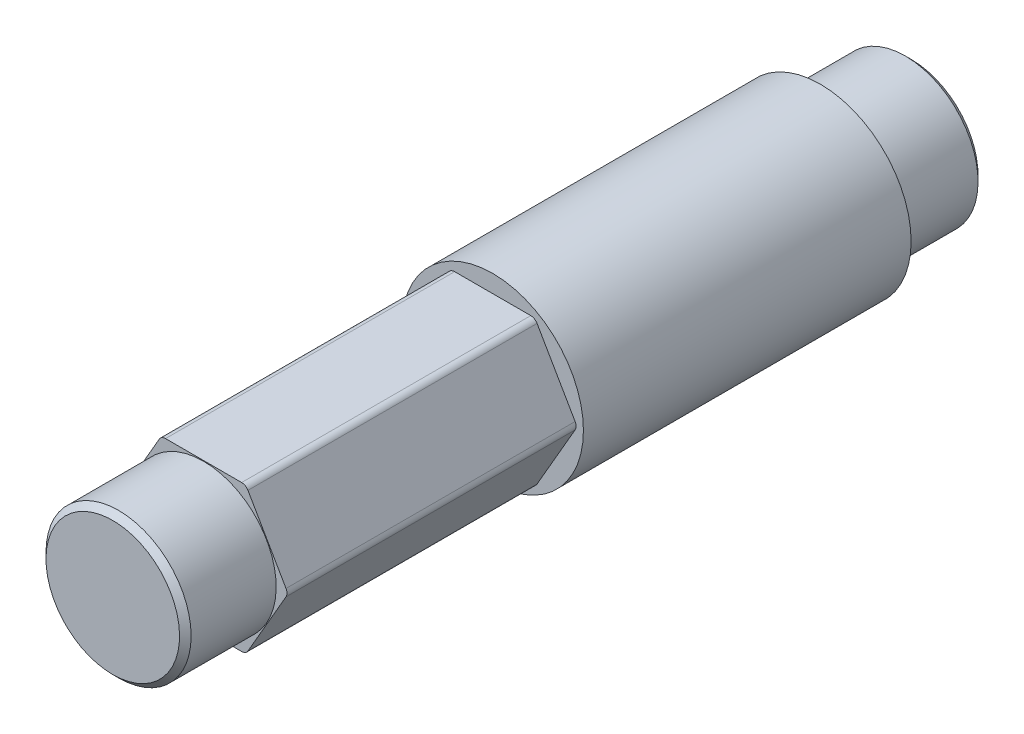
ISO-10303-21;
HEADER;
FILE_DESCRIPTION(('STEP AP214'),'2;1');
FILE_NAME('part.step','',(''),(''),'','','');
FILE_SCHEMA(('AUTOMOTIVE_DESIGN { 1 0 10303 214 1 1 1 1 }'));
ENDSEC;
DATA;
#1=APPLICATION_CONTEXT('core data for automotive mechanical design processes');
#2=APPLICATION_PROTOCOL_DEFINITION('international standard','automotive_design',2000,#1);
#3=PRODUCT_CONTEXT('',#1,'mechanical');
#4=PRODUCT('Part','Part','',(#3));
#5=PRODUCT_RELATED_PRODUCT_CATEGORY('part','',(#4));
#6=PRODUCT_DEFINITION_FORMATION('','',#4);
#7=PRODUCT_DEFINITION_CONTEXT('part definition',#1,'design');
#8=PRODUCT_DEFINITION('design','',#6,#7);
#9=PRODUCT_DEFINITION_SHAPE('','',#8);
#10=(LENGTH_UNIT() NAMED_UNIT(*) SI_UNIT(.MILLI.,.METRE.));
#11=(NAMED_UNIT(*) PLANE_ANGLE_UNIT() SI_UNIT($,.RADIAN.));
#12=(NAMED_UNIT(*) SI_UNIT($,.STERADIAN.) SOLID_ANGLE_UNIT());
#13=UNCERTAINTY_MEASURE_WITH_UNIT(LENGTH_MEASURE(1.E-05),#10,'distance_accuracy_value','');
#14=(GEOMETRIC_REPRESENTATION_CONTEXT(3) GLOBAL_UNCERTAINTY_ASSIGNED_CONTEXT((#13)) GLOBAL_UNIT_ASSIGNED_CONTEXT((#10,
#11,#12)) REPRESENTATION_CONTEXT('',''));
#15=CARTESIAN_POINT('',(0.,0.,0.));
#16=DIRECTION('',(0.,0.,1.));
#17=DIRECTION('',(1.,0.,0.));
#18=AXIS2_PLACEMENT_3D('',#15,#16,#17);
#19=CARTESIAN_POINT('',(0.,7.62,-33.2486));
#20=DIRECTION('',(0.,0.,1.));
#21=DIRECTION('',(0.,-1.,0.));
#22=AXIS2_PLACEMENT_3D('',#19,#20,#21);
#23=PLANE('',#22);
#24=CARTESIAN_POINT('',(0.,0.,-33.2486));
#25=DIRECTION('',(0.,0.,-1.));
#26=DIRECTION('',(0.,1.,0.));
#27=AXIS2_PLACEMENT_3D('',#24,#25,#26);
#28=CIRCLE('',#27,7.9375);
#29=CARTESIAN_POINT('',(0.,7.9375,-33.2486));
#30=VERTEX_POINT('',#29);
#31=EDGE_CURVE('E225',#30,#30,#28,.T.);
#32=ORIENTED_EDGE('',*,*,#31,.F.);
#33=EDGE_LOOP('',(#32));
#34=FACE_BOUND('',#33,.T.);
#35=DIRECTION('',(0.5,0.866025403784439,0.));
#36=VECTOR('',#35,1.);
#37=CARTESIAN_POINT('',(-3.6969700727127,6.40334,-33.2486));
#38=LINE('',#37,#36);
#39=CARTESIAN_POINT('',(-7.21063143495769,0.317499999999992,-33.2486));
#40=VERTEX_POINT('',#39);
#41=CARTESIAN_POINT('',(-3.88027878318041,6.08584,-33.2486));
#42=VERTEX_POINT('',#41);
#43=EDGE_CURVE('E196',#40,#42,#38,.T.);
#44=ORIENTED_EDGE('',*,*,#43,.T.);
#45=CARTESIAN_POINT('',(-3.33035265177729,5.76834,-33.2486));
#46=DIRECTION('',(0.,0.,1.));
#47=DIRECTION('',(0.,-1.,0.));
#48=AXIS2_PLACEMENT_3D('',#45,#46,#47);
#49=CIRCLE('',#48,0.635);
#50=CARTESIAN_POINT('',(-3.33035265177729,6.40334,-33.2486));
#51=VERTEX_POINT('',#50);
#52=EDGE_CURVE('E43',#42,#51,#49,.F.);
#53=ORIENTED_EDGE('',*,*,#52,.T.);
#54=DIRECTION('',(1.,0.,0.));
#55=VECTOR('',#54,1.);
#56=CARTESIAN_POINT('',(3.6969700727127,6.40334,-33.2486));
#57=LINE('',#56,#55);
#58=CARTESIAN_POINT('',(3.33035265177728,6.40334,-33.2486));
#59=VERTEX_POINT('',#58);
#60=EDGE_CURVE('E194',#51,#59,#57,.T.);
#61=ORIENTED_EDGE('',*,*,#60,.T.);
#62=CARTESIAN_POINT('',(3.33035265177728,5.76834,-33.2486));
#63=DIRECTION('',(0.,0.,1.));
#64=DIRECTION('',(0.,-1.,0.));
#65=AXIS2_PLACEMENT_3D('',#62,#63,#64);
#66=CIRCLE('',#65,0.635);
#67=CARTESIAN_POINT('',(3.8802787831804,6.08584,-33.2486));
#68=VERTEX_POINT('',#67);
#69=EDGE_CURVE('E190',#59,#68,#66,.F.);
#70=ORIENTED_EDGE('',*,*,#69,.T.);
#71=DIRECTION('',(0.5,-0.866025403784438,0.));
#72=VECTOR('',#71,1.);
#73=CARTESIAN_POINT('',(7.3939401454254,0.,-33.2486));
#74=LINE('',#73,#72);
#75=CARTESIAN_POINT('',(7.21063143495769,0.317500000000003,-33.2486));
#76=VERTEX_POINT('',#75);
#77=EDGE_CURVE('E204',#68,#76,#74,.T.);
#78=ORIENTED_EDGE('',*,*,#77,.T.);
#79=CARTESIAN_POINT('',(6.66070530355457,0.,-33.2486));
#80=DIRECTION('',(0.,0.,1.));
#81=DIRECTION('',(0.,-1.,0.));
#82=AXIS2_PLACEMENT_3D('',#79,#80,#81);
#83=CIRCLE('',#82,0.635);
#84=CARTESIAN_POINT('',(7.21063143495769,-0.317499999999996,-33.2486));
#85=VERTEX_POINT('',#84);
#86=EDGE_CURVE('E188',#76,#85,#83,.F.);
#87=ORIENTED_EDGE('',*,*,#86,.T.);
#88=DIRECTION('',(-0.5,-0.866025403784439,0.));
#89=VECTOR('',#88,1.);
#90=CARTESIAN_POINT('',(3.6969700727127,-6.40334,-33.2486));
#91=LINE('',#90,#89);
#92=CARTESIAN_POINT('',(3.8802787831804,-6.08584,-33.2486));
#93=VERTEX_POINT('',#92);
#94=EDGE_CURVE('E425',#85,#93,#91,.T.);
#95=ORIENTED_EDGE('',*,*,#94,.T.);
#96=CARTESIAN_POINT('',(3.33035265177729,-5.76834,-33.2486));
#97=DIRECTION('',(0.,0.,1.));
#98=DIRECTION('',(0.,-1.,0.));
#99=AXIS2_PLACEMENT_3D('',#96,#97,#98);
#100=CIRCLE('',#99,0.635);
#101=CARTESIAN_POINT('',(3.33035265177729,-6.40334,-33.2486));
#102=VERTEX_POINT('',#101);
#103=EDGE_CURVE('E186',#93,#102,#100,.F.);
#104=ORIENTED_EDGE('',*,*,#103,.T.);
#105=DIRECTION('',(-1.,0.,0.));
#106=VECTOR('',#105,1.);
#107=CARTESIAN_POINT('',(-3.69697007271269,-6.40334,-33.2486));
#108=LINE('',#107,#106);
#109=CARTESIAN_POINT('',(-3.33035265177728,-6.40334,-33.2486));
#110=VERTEX_POINT('',#109);
#111=EDGE_CURVE('E428',#102,#110,#108,.T.);
#112=ORIENTED_EDGE('',*,*,#111,.T.);
#113=CARTESIAN_POINT('',(-3.33035265177728,-5.76834,-33.2486));
#114=DIRECTION('',(0.,0.,1.));
#115=DIRECTION('',(0.,-1.,0.));
#116=AXIS2_PLACEMENT_3D('',#113,#114,#115);
#117=CIRCLE('',#116,0.635);
#118=CARTESIAN_POINT('',(-3.8802787831804,-6.08584,-33.2486));
#119=VERTEX_POINT('',#118);
#120=EDGE_CURVE('E184',#110,#119,#117,.F.);
#121=ORIENTED_EDGE('',*,*,#120,.T.);
#122=DIRECTION('',(-0.5,0.866025403784438,0.));
#123=VECTOR('',#122,1.);
#124=CARTESIAN_POINT('',(-7.39394014542539,0.,-33.2486));
#125=LINE('',#124,#123);
#126=CARTESIAN_POINT('',(-7.21063143495769,-0.317500000000004,-33.2486));
#127=VERTEX_POINT('',#126);
#128=EDGE_CURVE('E442',#119,#127,#125,.T.);
#129=ORIENTED_EDGE('',*,*,#128,.T.);
#130=CARTESIAN_POINT('',(-6.66070530355457,0.,-33.2486));
#131=DIRECTION('',(0.,0.,1.));
#132=DIRECTION('',(0.,-1.,0.));
#133=AXIS2_PLACEMENT_3D('',#130,#131,#132);
#134=CIRCLE('',#133,0.635);
#135=EDGE_CURVE('E12',#127,#40,#134,.F.);
#136=ORIENTED_EDGE('',*,*,#135,.T.);
#137=EDGE_LOOP('',(#44,#53,#61,#70,#78,#87,#95,#104,#112,#121,#129,#136));
#138=FACE_BOUND('',#137,.T.);
#139=ADVANCED_FACE('F35',(#34,#138),#23,.T.);
#140=CARTESIAN_POINT('',(0.,0.,0.));
#141=DIRECTION('',(0.,0.,-1.));
#142=DIRECTION('',(0.,1.,0.));
#143=AXIS2_PLACEMENT_3D('',#140,#141,#142);
#144=CYLINDRICAL_SURFACE('',#143,7.9375);
#145=ORIENTED_EDGE('',*,*,#31,.T.);
#146=EDGE_LOOP('',(#145));
#147=FACE_BOUND('',#146,.T.);
#148=CARTESIAN_POINT('',(0.,0.,-61.9252));
#149=DIRECTION('',(0.,0.,-1.));
#150=DIRECTION('',(0.,1.,0.));
#151=AXIS2_PLACEMENT_3D('',#148,#149,#150);
#152=CIRCLE('',#151,7.9375);
#153=CARTESIAN_POINT('',(0.,7.9375,-61.9252));
#154=VERTEX_POINT('',#153);
#155=EDGE_CURVE('E222',#154,#154,#152,.T.);
#156=ORIENTED_EDGE('',*,*,#155,.F.);
#157=EDGE_LOOP('',(#156));
#158=FACE_BOUND('',#157,.T.);
#159=ADVANCED_FACE('F258',(#147,#158),#144,.T.);
#160=CARTESIAN_POINT('',(0.,7.9375,-61.9252));
#161=DIRECTION('',(0.,0.,-1.));
#162=DIRECTION('',(0.,1.,0.));
#163=AXIS2_PLACEMENT_3D('',#160,#161,#162);
#164=PLANE('',#163);
#165=ORIENTED_EDGE('',*,*,#155,.T.);
#166=EDGE_LOOP('',(#165));
#167=FACE_BOUND('',#166,.T.);
#168=CARTESIAN_POINT('',(0.,0.,-61.9252));
#169=DIRECTION('',(0.,0.,-1.));
#170=DIRECTION('',(0.,1.,0.));
#171=AXIS2_PLACEMENT_3D('',#168,#169,#170);
#172=CIRCLE('',#171,6.34999999999999);
#173=CARTESIAN_POINT('',(0.,6.35,-61.9252));
#174=VERTEX_POINT('',#173);
#175=EDGE_CURVE('E219',#174,#174,#172,.T.);
#176=ORIENTED_EDGE('',*,*,#175,.F.);
#177=EDGE_LOOP('',(#176));
#178=FACE_BOUND('',#177,.T.);
#179=ADVANCED_FACE('F264',(#167,#178),#164,.T.);
#180=CARTESIAN_POINT('',(0.,0.,0.));
#181=DIRECTION('',(0.,0.,-1.));
#182=DIRECTION('',(0.,1.,0.));
#183=AXIS2_PLACEMENT_3D('',#180,#181,#182);
#184=CYLINDRICAL_SURFACE('',#183,6.34999999999999);
#185=CARTESIAN_POINT('',(0.,0.,-69.3674));
#186=DIRECTION('',(0.,0.,-1.));
#187=DIRECTION('',(0.,1.,0.));
#188=AXIS2_PLACEMENT_3D('',#185,#186,#187);
#189=CIRCLE('',#188,6.34999999999999);
#190=CARTESIAN_POINT('',(0.,6.35,-69.3674));
#191=VERTEX_POINT('',#190);
#192=EDGE_CURVE('E144',#191,#191,#189,.F.);
#193=ORIENTED_EDGE('',*,*,#192,.T.);
#194=EDGE_LOOP('',(#193));
#195=FACE_BOUND('',#194,.T.);
#196=ORIENTED_EDGE('',*,*,#175,.T.);
#197=EDGE_LOOP('',(#196));
#198=FACE_BOUND('',#197,.T.);
#199=ADVANCED_FACE('F304',(#195,#198),#184,.T.);
#200=CARTESIAN_POINT('',(0.,6.35,-69.8754));
#201=DIRECTION('',(0.,0.,-1.));
#202=DIRECTION('',(0.,1.,0.));
#203=AXIS2_PLACEMENT_3D('',#200,#201,#202);
#204=PLANE('',#203);
#205=CARTESIAN_POINT('',(0.,0.,-69.8754));
#206=DIRECTION('',(0.,0.,-1.));
#207=DIRECTION('',(0.,1.,0.));
#208=AXIS2_PLACEMENT_3D('',#205,#206,#207);
#209=CIRCLE('',#208,5.842);
#210=CARTESIAN_POINT('',(0.,5.84200000000001,-69.8754));
#211=VERTEX_POINT('',#210);
#212=EDGE_CURVE('E148',#211,#211,#209,.T.);
#213=ORIENTED_EDGE('',*,*,#212,.T.);
#214=EDGE_LOOP('',(#213));
#215=FACE_BOUND('',#214,.T.);
#216=ADVANCED_FACE('F239',(#215),#204,.T.);
#217=CARTESIAN_POINT('',(3.6969700727127,6.40334,-55.9237467056996));
#218=DIRECTION('',(0.,1.,0.));
#219=DIRECTION('',(-1.,0.,0.));
#220=AXIS2_PLACEMENT_3D('',#217,#218,#219);
#221=PLANE('',#220);
#222=DIRECTION('',(-1.,0.,0.));
#223=VECTOR('',#222,1.);
#224=CARTESIAN_POINT('',(3.6969700727127,6.40334,-7.9502));
#225=LINE('',#224,#223);
#226=CARTESIAN_POINT('',(3.33035265177728,6.40334,-7.9502));
#227=VERTEX_POINT('',#226);
#228=CARTESIAN_POINT('',(-3.33035265177729,6.40334,-7.9502));
#229=VERTEX_POINT('',#228);
#230=EDGE_CURVE('E208',#227,#229,#225,.T.);
#231=ORIENTED_EDGE('',*,*,#230,.F.);
#232=DIRECTION('',(0.,0.,1.));
#233=VECTOR('',#232,1.);
#234=CARTESIAN_POINT('',(3.33035265177728,6.40334,-55.9237467056996));
#235=LINE('',#234,#233);
#236=EDGE_CURVE('E179',#227,#59,#235,.F.);
#237=ORIENTED_EDGE('',*,*,#236,.T.);
#238=ORIENTED_EDGE('',*,*,#60,.F.);
#239=DIRECTION('',(0.,0.,1.));
#240=VECTOR('',#239,1.);
#241=CARTESIAN_POINT('',(-3.33035265177729,6.40334,-55.9237467056996));
#242=LINE('',#241,#240);
#243=EDGE_CURVE('E176',#51,#229,#242,.T.);
#244=ORIENTED_EDGE('',*,*,#243,.T.);
#245=EDGE_LOOP('',(#231,#237,#238,#244));
#246=FACE_BOUND('',#245,.T.);
#247=ADVANCED_FACE('F201',(#246),#221,.T.);
#248=CARTESIAN_POINT('',(-3.6969700727127,6.40334,-55.9237467056996));
#249=DIRECTION('',(-0.866025403784439,0.499999999999999,0.));
#250=DIRECTION('',(-0.5,-0.866025403784439,0.));
#251=AXIS2_PLACEMENT_3D('',#248,#249,#250);
#252=PLANE('',#251);
#253=DIRECTION('',(-0.499999999999999,-0.866025403784439,0.));
#254=VECTOR('',#253,1.);
#255=CARTESIAN_POINT('',(-3.6969700727127,6.40334,-7.9502));
#256=LINE('',#255,#254);
#257=CARTESIAN_POINT('',(-3.8802787831804,6.08584,-7.9502));
#258=VERTEX_POINT('',#257);
#259=CARTESIAN_POINT('',(-7.21063143495769,0.317499999999997,-7.9502));
#260=VERTEX_POINT('',#259);
#261=EDGE_CURVE('E128',#258,#260,#256,.T.);
#262=ORIENTED_EDGE('',*,*,#261,.F.);
#263=DIRECTION('',(0.,0.,1.));
#264=VECTOR('',#263,1.);
#265=CARTESIAN_POINT('',(-3.8802787831804,6.08584,-55.9237467056996));
#266=LINE('',#265,#264);
#267=EDGE_CURVE('E50',#258,#42,#266,.F.);
#268=ORIENTED_EDGE('',*,*,#267,.T.);
#269=ORIENTED_EDGE('',*,*,#43,.F.);
#270=DIRECTION('',(0.,0.,1.));
#271=VECTOR('',#270,1.);
#272=CARTESIAN_POINT('',(-7.21063143495769,0.317499999999995,-55.9237467056996));
#273=LINE('',#272,#271);
#274=EDGE_CURVE('E181',#40,#260,#273,.T.);
#275=ORIENTED_EDGE('',*,*,#274,.T.);
#276=EDGE_LOOP('',(#262,#268,#269,#275));
#277=FACE_BOUND('',#276,.T.);
#278=ADVANCED_FACE('F209',(#277),#252,.T.);
#279=CARTESIAN_POINT('',(-7.39394014542539,0.,-55.9237467056996));
#280=DIRECTION('',(-0.866025403784438,-0.5,0.));
#281=DIRECTION('',(0.5,-0.866025403784438,0.));
#282=AXIS2_PLACEMENT_3D('',#279,#280,#281);
#283=PLANE('',#282);
#284=ORIENTED_EDGE('',*,*,#128,.F.);
#285=DIRECTION('',(0.,0.,1.));
#286=VECTOR('',#285,1.);
#287=CARTESIAN_POINT('',(-3.8802787831804,-6.08584,-55.9237467056996));
#288=LINE('',#287,#286);
#289=CARTESIAN_POINT('',(-3.8802787831804,-6.08584,-7.9502));
#290=VERTEX_POINT('',#289);
#291=EDGE_CURVE('E134',#119,#290,#288,.T.);
#292=ORIENTED_EDGE('',*,*,#291,.T.);
#293=DIRECTION('',(0.5,-0.866025403784438,0.));
#294=VECTOR('',#293,1.);
#295=CARTESIAN_POINT('',(-7.39394014542539,0.,-7.9502));
#296=LINE('',#295,#294);
#297=CARTESIAN_POINT('',(-7.21063143495769,-0.317500000000004,-7.9502));
#298=VERTEX_POINT('',#297);
#299=EDGE_CURVE('E127',#298,#290,#296,.T.);
#300=ORIENTED_EDGE('',*,*,#299,.F.);
#301=DIRECTION('',(0.,0.,1.));
#302=VECTOR('',#301,1.);
#303=CARTESIAN_POINT('',(-7.21063143495769,-0.317500000000004,-55.9237467056996));
#304=LINE('',#303,#302);
#305=EDGE_CURVE('E140',#298,#127,#304,.F.);
#306=ORIENTED_EDGE('',*,*,#305,.T.);
#307=EDGE_LOOP('',(#284,#292,#300,#306));
#308=FACE_BOUND('',#307,.T.);
#309=ADVANCED_FACE('F139',(#308),#283,.T.);
#310=CARTESIAN_POINT('',(-3.69697007271269,-6.40334,-55.9237467056996));
#311=DIRECTION('',(0.,-1.,0.));
#312=DIRECTION('',(1.,0.,0.));
#313=AXIS2_PLACEMENT_3D('',#310,#311,#312);
#314=PLANE('',#313);
#315=DIRECTION('',(1.,0.,0.));
#316=VECTOR('',#315,1.);
#317=CARTESIAN_POINT('',(-3.69697007271269,-6.40334,-7.9502));
#318=LINE('',#317,#316);
#319=CARTESIAN_POINT('',(-3.33035265177728,-6.40334,-7.9502));
#320=VERTEX_POINT('',#319);
#321=CARTESIAN_POINT('',(3.33035265177729,-6.40334,-7.9502));
#322=VERTEX_POINT('',#321);
#323=EDGE_CURVE('E142',#320,#322,#318,.T.);
#324=ORIENTED_EDGE('',*,*,#323,.F.);
#325=DIRECTION('',(0.,0.,1.));
#326=VECTOR('',#325,1.);
#327=CARTESIAN_POINT('',(-3.33035265177728,-6.40334,-55.9237467056996));
#328=LINE('',#327,#326);
#329=EDGE_CURVE('E164',#320,#110,#328,.F.);
#330=ORIENTED_EDGE('',*,*,#329,.T.);
#331=ORIENTED_EDGE('',*,*,#111,.F.);
#332=DIRECTION('',(0.,0.,1.));
#333=VECTOR('',#332,1.);
#334=CARTESIAN_POINT('',(3.33035265177729,-6.40334,-55.9237467056996));
#335=LINE('',#334,#333);
#336=EDGE_CURVE('E161',#102,#322,#335,.T.);
#337=ORIENTED_EDGE('',*,*,#336,.T.);
#338=EDGE_LOOP('',(#324,#330,#331,#337));
#339=FACE_BOUND('',#338,.T.);
#340=ADVANCED_FACE('F295',(#339),#314,.T.);
#341=CARTESIAN_POINT('',(3.6969700727127,-6.40334,-55.9237467056996));
#342=DIRECTION('',(0.866025403784439,-0.5,0.));
#343=DIRECTION('',(0.5,0.866025403784439,0.));
#344=AXIS2_PLACEMENT_3D('',#341,#342,#343);
#345=PLANE('',#344);
#346=DIRECTION('',(0.5,0.866025403784439,0.));
#347=VECTOR('',#346,1.);
#348=CARTESIAN_POINT('',(3.6969700727127,-6.40334,-7.9502));
#349=LINE('',#348,#347);
#350=CARTESIAN_POINT('',(3.8802787831804,-6.08584,-7.9502));
#351=VERTEX_POINT('',#350);
#352=CARTESIAN_POINT('',(7.21063143495769,-0.317499999999997,-7.9502));
#353=VERTEX_POINT('',#352);
#354=EDGE_CURVE('E205',#351,#353,#349,.T.);
#355=ORIENTED_EDGE('',*,*,#354,.F.);
#356=DIRECTION('',(0.,0.,1.));
#357=VECTOR('',#356,1.);
#358=CARTESIAN_POINT('',(3.8802787831804,-6.08584,-55.9237467056996));
#359=LINE('',#358,#357);
#360=EDGE_CURVE('E169',#351,#93,#359,.F.);
#361=ORIENTED_EDGE('',*,*,#360,.T.);
#362=ORIENTED_EDGE('',*,*,#94,.F.);
#363=DIRECTION('',(0.,0.,1.));
#364=VECTOR('',#363,1.);
#365=CARTESIAN_POINT('',(7.21063143495769,-0.317499999999995,-55.9237467056996));
#366=LINE('',#365,#364);
#367=EDGE_CURVE('E166',#85,#353,#366,.T.);
#368=ORIENTED_EDGE('',*,*,#367,.T.);
#369=EDGE_LOOP('',(#355,#361,#362,#368));
#370=FACE_BOUND('',#369,.T.);
#371=ADVANCED_FACE('F284',(#370),#345,.T.);
#372=CARTESIAN_POINT('',(7.3939401454254,0.,-55.9237467056996));
#373=DIRECTION('',(0.866025403784438,0.5,0.));
#374=DIRECTION('',(-0.5,0.866025403784438,0.));
#375=AXIS2_PLACEMENT_3D('',#372,#373,#374);
#376=PLANE('',#375);
#377=DIRECTION('',(-0.5,0.866025403784439,0.));
#378=VECTOR('',#377,1.);
#379=CARTESIAN_POINT('',(7.3939401454254,0.,-7.9502));
#380=LINE('',#379,#378);
#381=CARTESIAN_POINT('',(7.21063143495769,0.317500000000004,-7.9502));
#382=VERTEX_POINT('',#381);
#383=CARTESIAN_POINT('',(3.8802787831804,6.08584,-7.9502));
#384=VERTEX_POINT('',#383);
#385=EDGE_CURVE('E211',#382,#384,#380,.T.);
#386=ORIENTED_EDGE('',*,*,#385,.F.);
#387=DIRECTION('',(0.,0.,1.));
#388=VECTOR('',#387,1.);
#389=CARTESIAN_POINT('',(7.21063143495769,0.317500000000004,-55.9237467056996));
#390=LINE('',#389,#388);
#391=EDGE_CURVE('E174',#382,#76,#390,.F.);
#392=ORIENTED_EDGE('',*,*,#391,.T.);
#393=ORIENTED_EDGE('',*,*,#77,.F.);
#394=DIRECTION('',(0.,0.,1.));
#395=VECTOR('',#394,1.);
#396=CARTESIAN_POINT('',(3.8802787831804,6.08584,-55.9237467056996));
#397=LINE('',#396,#395);
#398=EDGE_CURVE('E171',#68,#384,#397,.T.);
#399=ORIENTED_EDGE('',*,*,#398,.T.);
#400=EDGE_LOOP('',(#386,#392,#393,#399));
#401=FACE_BOUND('',#400,.T.);
#402=ADVANCED_FACE('F279',(#401),#376,.T.);
#403=CARTESIAN_POINT('',(0.,0.,0.));
#404=DIRECTION('',(0.,0.,1.));
#405=DIRECTION('',(0.,-1.,0.));
#406=AXIS2_PLACEMENT_3D('',#403,#404,#405);
#407=PLANE('',#406);
#408=CARTESIAN_POINT('',(0.,0.,0.));
#409=DIRECTION('',(0.,0.,1.));
#410=DIRECTION('',(0.,-1.,0.));
#411=AXIS2_PLACEMENT_3D('',#408,#409,#410);
#412=CIRCLE('',#411,5.842);
#413=CARTESIAN_POINT('',(0.,-5.842,0.));
#414=VERTEX_POINT('',#413);
#415=EDGE_CURVE('E234',#414,#414,#412,.T.);
#416=ORIENTED_EDGE('',*,*,#415,.T.);
#417=EDGE_LOOP('',(#416));
#418=FACE_BOUND('',#417,.T.);
#419=ADVANCED_FACE('F276',(#418),#407,.T.);
#420=CARTESIAN_POINT('',(0.,0.,0.));
#421=DIRECTION('',(0.,0.,-1.));
#422=DIRECTION('',(0.,1.,0.));
#423=AXIS2_PLACEMENT_3D('',#420,#421,#422);
#424=CYLINDRICAL_SURFACE('',#423,6.35);
#425=CARTESIAN_POINT('',(0.,0.,-0.508000000000006));
#426=DIRECTION('',(0.,0.,1.));
#427=DIRECTION('',(0.,-1.,0.));
#428=AXIS2_PLACEMENT_3D('',#425,#426,#427);
#429=CIRCLE('',#428,6.35);
#430=CARTESIAN_POINT('',(0.,-6.35,-0.508000000000007));
#431=VERTEX_POINT('',#430);
#432=EDGE_CURVE('E231',#431,#431,#429,.F.);
#433=ORIENTED_EDGE('',*,*,#432,.T.);
#434=EDGE_LOOP('',(#433));
#435=FACE_BOUND('',#434,.T.);
#436=CARTESIAN_POINT('',(0.,0.,-7.9502));
#437=DIRECTION('',(0.,0.,-1.));
#438=DIRECTION('',(0.,1.,0.));
#439=AXIS2_PLACEMENT_3D('',#436,#437,#438);
#440=CIRCLE('',#439,6.35);
#441=CARTESIAN_POINT('',(0.,6.35,-7.9502));
#442=VERTEX_POINT('',#441);
#443=EDGE_CURVE('E228',#442,#442,#440,.T.);
#444=ORIENTED_EDGE('',*,*,#443,.F.);
#445=EDGE_LOOP('',(#444));
#446=FACE_BOUND('',#445,.T.);
#447=ADVANCED_FACE('F272',(#435,#446),#424,.T.);
#448=CARTESIAN_POINT('',(0.,6.35,-7.9502));
#449=DIRECTION('',(0.,0.,1.));
#450=DIRECTION('',(0.,-1.,0.));
#451=AXIS2_PLACEMENT_3D('',#448,#449,#450);
#452=PLANE('',#451);
#453=ORIENTED_EDGE('',*,*,#443,.T.);
#454=EDGE_LOOP('',(#453));
#455=FACE_BOUND('',#454,.T.);
#456=ORIENTED_EDGE('',*,*,#299,.T.);
#457=CARTESIAN_POINT('',(-3.33035265177728,-5.76834,-7.9502));
#458=DIRECTION('',(0.,0.,1.));
#459=DIRECTION('',(0.,-1.,0.));
#460=AXIS2_PLACEMENT_3D('',#457,#458,#459);
#461=CIRCLE('',#460,0.635);
#462=EDGE_CURVE('E159',#290,#320,#461,.T.);
#463=ORIENTED_EDGE('',*,*,#462,.T.);
#464=ORIENTED_EDGE('',*,*,#323,.T.);
#465=CARTESIAN_POINT('',(3.33035265177729,-5.76834,-7.9502));
#466=DIRECTION('',(0.,0.,1.));
#467=DIRECTION('',(0.,-1.,0.));
#468=AXIS2_PLACEMENT_3D('',#465,#466,#467);
#469=CIRCLE('',#468,0.635);
#470=EDGE_CURVE('E157',#322,#351,#469,.T.);
#471=ORIENTED_EDGE('',*,*,#470,.T.);
#472=ORIENTED_EDGE('',*,*,#354,.T.);
#473=CARTESIAN_POINT('',(6.66070530355457,0.,-7.9502));
#474=DIRECTION('',(0.,0.,1.));
#475=DIRECTION('',(0.,-1.,0.));
#476=AXIS2_PLACEMENT_3D('',#473,#474,#475);
#477=CIRCLE('',#476,0.635);
#478=EDGE_CURVE('E155',#353,#382,#477,.T.);
#479=ORIENTED_EDGE('',*,*,#478,.T.);
#480=ORIENTED_EDGE('',*,*,#385,.T.);
#481=CARTESIAN_POINT('',(3.33035265177728,5.76834,-7.9502));
#482=DIRECTION('',(0.,0.,1.));
#483=DIRECTION('',(0.,-1.,0.));
#484=AXIS2_PLACEMENT_3D('',#481,#482,#483);
#485=CIRCLE('',#484,0.635);
#486=EDGE_CURVE('E153',#384,#227,#485,.T.);
#487=ORIENTED_EDGE('',*,*,#486,.T.);
#488=ORIENTED_EDGE('',*,*,#230,.T.);
#489=CARTESIAN_POINT('',(-3.33035265177729,5.76834,-7.9502));
#490=DIRECTION('',(0.,0.,1.));
#491=DIRECTION('',(0.,-1.,0.));
#492=AXIS2_PLACEMENT_3D('',#489,#490,#491);
#493=CIRCLE('',#492,0.635);
#494=EDGE_CURVE('E133',#229,#258,#493,.T.);
#495=ORIENTED_EDGE('',*,*,#494,.T.);
#496=ORIENTED_EDGE('',*,*,#261,.T.);
#497=CARTESIAN_POINT('',(-6.66070530355457,0.,-7.9502));
#498=DIRECTION('',(0.,0.,1.));
#499=DIRECTION('',(0.,-1.,0.));
#500=AXIS2_PLACEMENT_3D('',#497,#498,#499);
#501=CIRCLE('',#500,0.635);
#502=EDGE_CURVE('E124',#260,#298,#501,.T.);
#503=ORIENTED_EDGE('',*,*,#502,.T.);
#504=EDGE_LOOP('',(#456,#463,#464,#471,#472,#479,#480,#487,#488,#495,#496,#503));
#505=FACE_BOUND('',#504,.T.);
#506=ADVANCED_FACE('F126',(#455,#505),#452,.T.);
#507=CARTESIAN_POINT('',(0.,0.,-0.508000000000006));
#508=DIRECTION('',(0.,0.,-1.));
#509=DIRECTION('',(0.,1.,0.));
#510=AXIS2_PLACEMENT_3D('',#507,#508,#509);
#511=CONICAL_SURFACE('',#510,6.35,0.785398163397447);
#512=ORIENTED_EDGE('',*,*,#415,.F.);
#513=EDGE_LOOP('',(#512));
#514=FACE_BOUND('',#513,.T.);
#515=ORIENTED_EDGE('',*,*,#432,.F.);
#516=EDGE_LOOP('',(#515));
#517=FACE_BOUND('',#516,.T.);
#518=ADVANCED_FACE('F244',(#514,#517),#511,.T.);
#519=CARTESIAN_POINT('',(0.,0.,-69.8754));
#520=DIRECTION('',(0.,0.,1.));
#521=DIRECTION('',(0.,-1.,0.));
#522=AXIS2_PLACEMENT_3D('',#519,#520,#521);
#523=CONICAL_SURFACE('',#522,5.842,0.785398163397446);
#524=ORIENTED_EDGE('',*,*,#192,.F.);
#525=EDGE_LOOP('',(#524));
#526=FACE_BOUND('',#525,.T.);
#527=ORIENTED_EDGE('',*,*,#212,.F.);
#528=EDGE_LOOP('',(#527));
#529=FACE_BOUND('',#528,.T.);
#530=ADVANCED_FACE('F241',(#526,#529),#523,.T.);
#531=CARTESIAN_POINT('',(-3.33035265177728,-5.76834,-55.9237467056996));
#532=DIRECTION('',(0.,0.,1.));
#533=DIRECTION('',(1.,0.,0.));
#534=AXIS2_PLACEMENT_3D('',#531,#532,#533);
#535=CYLINDRICAL_SURFACE('',#534,0.635);
#536=ORIENTED_EDGE('',*,*,#120,.F.);
#537=ORIENTED_EDGE('',*,*,#329,.F.);
#538=ORIENTED_EDGE('',*,*,#462,.F.);
#539=ORIENTED_EDGE('',*,*,#291,.F.);
#540=EDGE_LOOP('',(#536,#537,#538,#539));
#541=FACE_BOUND('',#540,.T.);
#542=ADVANCED_FACE('F243',(#541),#535,.T.);
#543=CARTESIAN_POINT('',(3.33035265177729,-5.76834,-55.9237467056996));
#544=DIRECTION('',(0.,0.,1.));
#545=DIRECTION('',(1.,0.,0.));
#546=AXIS2_PLACEMENT_3D('',#543,#544,#545);
#547=CYLINDRICAL_SURFACE('',#546,0.635);
#548=ORIENTED_EDGE('',*,*,#103,.F.);
#549=ORIENTED_EDGE('',*,*,#360,.F.);
#550=ORIENTED_EDGE('',*,*,#470,.F.);
#551=ORIENTED_EDGE('',*,*,#336,.F.);
#552=EDGE_LOOP('',(#548,#549,#550,#551));
#553=FACE_BOUND('',#552,.T.);
#554=ADVANCED_FACE('F251',(#553),#547,.T.);
#555=CARTESIAN_POINT('',(6.66070530355457,0.,-55.9237467056996));
#556=DIRECTION('',(0.,0.,1.));
#557=DIRECTION('',(1.,0.,0.));
#558=AXIS2_PLACEMENT_3D('',#555,#556,#557);
#559=CYLINDRICAL_SURFACE('',#558,0.635);
#560=ORIENTED_EDGE('',*,*,#86,.F.);
#561=ORIENTED_EDGE('',*,*,#391,.F.);
#562=ORIENTED_EDGE('',*,*,#478,.F.);
#563=ORIENTED_EDGE('',*,*,#367,.F.);
#564=EDGE_LOOP('',(#560,#561,#562,#563));
#565=FACE_BOUND('',#564,.T.);
#566=ADVANCED_FACE('F381',(#565),#559,.T.);
#567=CARTESIAN_POINT('',(3.33035265177728,5.76834,-55.9237467056996));
#568=DIRECTION('',(0.,0.,1.));
#569=DIRECTION('',(1.,0.,0.));
#570=AXIS2_PLACEMENT_3D('',#567,#568,#569);
#571=CYLINDRICAL_SURFACE('',#570,0.635);
#572=ORIENTED_EDGE('',*,*,#69,.F.);
#573=ORIENTED_EDGE('',*,*,#236,.F.);
#574=ORIENTED_EDGE('',*,*,#486,.F.);
#575=ORIENTED_EDGE('',*,*,#398,.F.);
#576=EDGE_LOOP('',(#572,#573,#574,#575));
#577=FACE_BOUND('',#576,.T.);
#578=ADVANCED_FACE('F391',(#577),#571,.T.);
#579=CARTESIAN_POINT('',(-3.33035265177729,5.76834,-55.9237467056996));
#580=DIRECTION('',(0.,0.,1.));
#581=DIRECTION('',(1.,0.,0.));
#582=AXIS2_PLACEMENT_3D('',#579,#580,#581);
#583=CYLINDRICAL_SURFACE('',#582,0.635);
#584=ORIENTED_EDGE('',*,*,#52,.F.);
#585=ORIENTED_EDGE('',*,*,#267,.F.);
#586=ORIENTED_EDGE('',*,*,#494,.F.);
#587=ORIENTED_EDGE('',*,*,#243,.F.);
#588=EDGE_LOOP('',(#584,#585,#586,#587));
#589=FACE_BOUND('',#588,.T.);
#590=ADVANCED_FACE('F207',(#589),#583,.T.);
#591=CARTESIAN_POINT('',(-6.66070530355457,0.,-55.9237467056996));
#592=DIRECTION('',(0.,0.,1.));
#593=DIRECTION('',(1.,0.,0.));
#594=AXIS2_PLACEMENT_3D('',#591,#592,#593);
#595=CYLINDRICAL_SURFACE('',#594,0.635);
#596=ORIENTED_EDGE('',*,*,#135,.F.);
#597=ORIENTED_EDGE('',*,*,#305,.F.);
#598=ORIENTED_EDGE('',*,*,#502,.F.);
#599=ORIENTED_EDGE('',*,*,#274,.F.);
#600=EDGE_LOOP('',(#596,#597,#598,#599));
#601=FACE_BOUND('',#600,.T.);
#602=ADVANCED_FACE('F37',(#601),#595,.T.);
#603=CLOSED_SHELL('',(#139,#159,#179,#199,#216,#247,#278,#309,#340,#371,#402,#419,#447,#506,
#518,#530,#542,#554,#566,#578,#590,#602));
#604=MANIFOLD_SOLID_BREP('B2',#603);
#605=ADVANCED_BREP_SHAPE_REPRESENTATION('',(#18,#604),#14);
#606=SHAPE_DEFINITION_REPRESENTATION(#9,#605);
ENDSEC;
END-ISO-10303-21;
